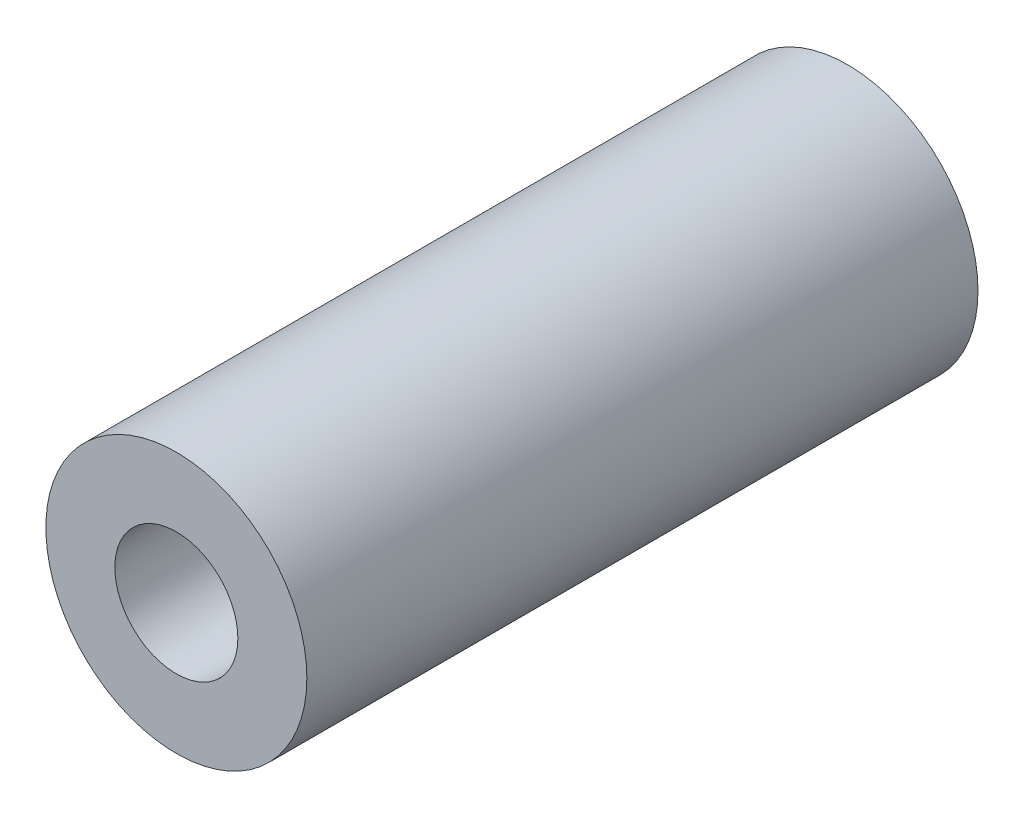
ISO-10303-21;
HEADER;
FILE_DESCRIPTION(('STEP AP214'),'2;1');
FILE_NAME('part.step','',(''),(''),'','','');
FILE_SCHEMA(('AUTOMOTIVE_DESIGN { 1 0 10303 214 1 1 1 1 }'));
ENDSEC;
DATA;
#1=APPLICATION_CONTEXT('core data for automotive mechanical design processes');
#2=APPLICATION_PROTOCOL_DEFINITION('international standard','automotive_design',2000,#1);
#3=PRODUCT_CONTEXT('',#1,'mechanical');
#4=PRODUCT('Part','Part','',(#3));
#5=PRODUCT_RELATED_PRODUCT_CATEGORY('part','',(#4));
#6=PRODUCT_DEFINITION_FORMATION('','',#4);
#7=PRODUCT_DEFINITION_CONTEXT('part definition',#1,'design');
#8=PRODUCT_DEFINITION('design','',#6,#7);
#9=PRODUCT_DEFINITION_SHAPE('','',#8);
#10=(LENGTH_UNIT() NAMED_UNIT(*) SI_UNIT(.MILLI.,.METRE.));
#11=(NAMED_UNIT(*) PLANE_ANGLE_UNIT() SI_UNIT($,.RADIAN.));
#12=(NAMED_UNIT(*) SI_UNIT($,.STERADIAN.) SOLID_ANGLE_UNIT());
#13=UNCERTAINTY_MEASURE_WITH_UNIT(LENGTH_MEASURE(1.E-05),#10,'distance_accuracy_value','');
#14=(GEOMETRIC_REPRESENTATION_CONTEXT(3) GLOBAL_UNCERTAINTY_ASSIGNED_CONTEXT((#13)) GLOBAL_UNIT_ASSIGNED_CONTEXT((#10,
#11,#12)) REPRESENTATION_CONTEXT('',''));
#15=CARTESIAN_POINT('',(0.,0.,0.));
#16=DIRECTION('',(0.,0.,1.));
#17=DIRECTION('',(1.,0.,0.));
#18=AXIS2_PLACEMENT_3D('',#15,#16,#17);
#19=CARTESIAN_POINT('',(21.9203102167829,0.,372.));
#20=DIRECTION('',(0.,0.,-1.));
#21=DIRECTION('',(-1.,0.,0.));
#22=AXIS2_PLACEMENT_3D('',#19,#20,#21);
#23=CYLINDRICAL_SURFACE('',#22,1.65);
#24=CARTESIAN_POINT('',(21.9203102167829,0.,372.));
#25=DIRECTION('',(0.,0.,1.));
#26=DIRECTION('',(1.,0.,0.));
#27=AXIS2_PLACEMENT_3D('',#24,#25,#26);
#28=CIRCLE('',#27,1.65);
#29=CARTESIAN_POINT('',(23.5703102167829,0.,372.));
#30=VERTEX_POINT('',#29);
#31=EDGE_CURVE('E9',#30,#30,#28,.T.);
#32=ORIENTED_EDGE('',*,*,#31,.T.);
#33=EDGE_LOOP('',(#32));
#34=FACE_BOUND('',#33,.T.);
#35=CARTESIAN_POINT('',(21.9203102167829,0.,354.));
#36=DIRECTION('',(0.,0.,1.));
#37=DIRECTION('',(1.,0.,0.));
#38=AXIS2_PLACEMENT_3D('',#35,#36,#37);
#39=CIRCLE('',#38,1.65);
#40=CARTESIAN_POINT('',(23.5703102167829,0.,354.));
#41=VERTEX_POINT('',#40);
#42=EDGE_CURVE('E18',#41,#41,#39,.T.);
#43=ORIENTED_EDGE('',*,*,#42,.F.);
#44=EDGE_LOOP('',(#43));
#45=FACE_BOUND('',#44,.T.);
#46=ADVANCED_FACE('F14',(#34,#45),#23,.F.);
#47=CARTESIAN_POINT('',(21.9203102167829,0.,372.));
#48=DIRECTION('',(0.,0.,-1.));
#49=DIRECTION('',(-1.,0.,0.));
#50=AXIS2_PLACEMENT_3D('',#47,#48,#49);
#51=CYLINDRICAL_SURFACE('',#50,3.5);
#52=CARTESIAN_POINT('',(21.9203102167829,0.,372.));
#53=DIRECTION('',(0.,0.,1.));
#54=DIRECTION('',(1.,0.,0.));
#55=AXIS2_PLACEMENT_3D('',#52,#53,#54);
#56=CIRCLE('',#55,3.5);
#57=CARTESIAN_POINT('',(25.4203102167829,0.,372.));
#58=VERTEX_POINT('',#57);
#59=EDGE_CURVE('E23',#58,#58,#56,.T.);
#60=ORIENTED_EDGE('',*,*,#59,.F.);
#61=EDGE_LOOP('',(#60));
#62=FACE_BOUND('',#61,.T.);
#63=CARTESIAN_POINT('',(21.9203102167829,0.,354.));
#64=DIRECTION('',(0.,0.,1.));
#65=DIRECTION('',(1.,0.,0.));
#66=AXIS2_PLACEMENT_3D('',#63,#64,#65);
#67=CIRCLE('',#66,3.5);
#68=CARTESIAN_POINT('',(25.4203102167829,0.,354.));
#69=VERTEX_POINT('',#68);
#70=EDGE_CURVE('E34',#69,#69,#67,.T.);
#71=ORIENTED_EDGE('',*,*,#70,.T.);
#72=EDGE_LOOP('',(#71));
#73=FACE_BOUND('',#72,.T.);
#74=ADVANCED_FACE('F16',(#62,#73),#51,.T.);
#75=CARTESIAN_POINT('',(0.,0.,372.));
#76=DIRECTION('',(0.,0.,1.));
#77=DIRECTION('',(1.,0.,0.));
#78=AXIS2_PLACEMENT_3D('',#75,#76,#77);
#79=PLANE('',#78);
#80=ORIENTED_EDGE('',*,*,#31,.F.);
#81=EDGE_LOOP('',(#80));
#82=FACE_BOUND('',#81,.T.);
#83=ORIENTED_EDGE('',*,*,#59,.T.);
#84=EDGE_LOOP('',(#83));
#85=FACE_BOUND('',#84,.T.);
#86=ADVANCED_FACE('F52',(#82,#85),#79,.T.);
#87=CARTESIAN_POINT('',(0.,0.,354.));
#88=DIRECTION('',(0.,0.,1.));
#89=DIRECTION('',(1.,0.,0.));
#90=AXIS2_PLACEMENT_3D('',#87,#88,#89);
#91=PLANE('',#90);
#92=ORIENTED_EDGE('',*,*,#42,.T.);
#93=EDGE_LOOP('',(#92));
#94=FACE_BOUND('',#93,.T.);
#95=ORIENTED_EDGE('',*,*,#70,.F.);
#96=EDGE_LOOP('',(#95));
#97=FACE_BOUND('',#96,.T.);
#98=ADVANCED_FACE('F44',(#94,#97),#91,.F.);
#99=CLOSED_SHELL('',(#46,#74,#86,#98));
#100=MANIFOLD_SOLID_BREP('B1',#99);
#101=ADVANCED_BREP_SHAPE_REPRESENTATION('',(#18,#100),#14);
#102=SHAPE_DEFINITION_REPRESENTATION(#9,#101);
ENDSEC;
END-ISO-10303-21;
